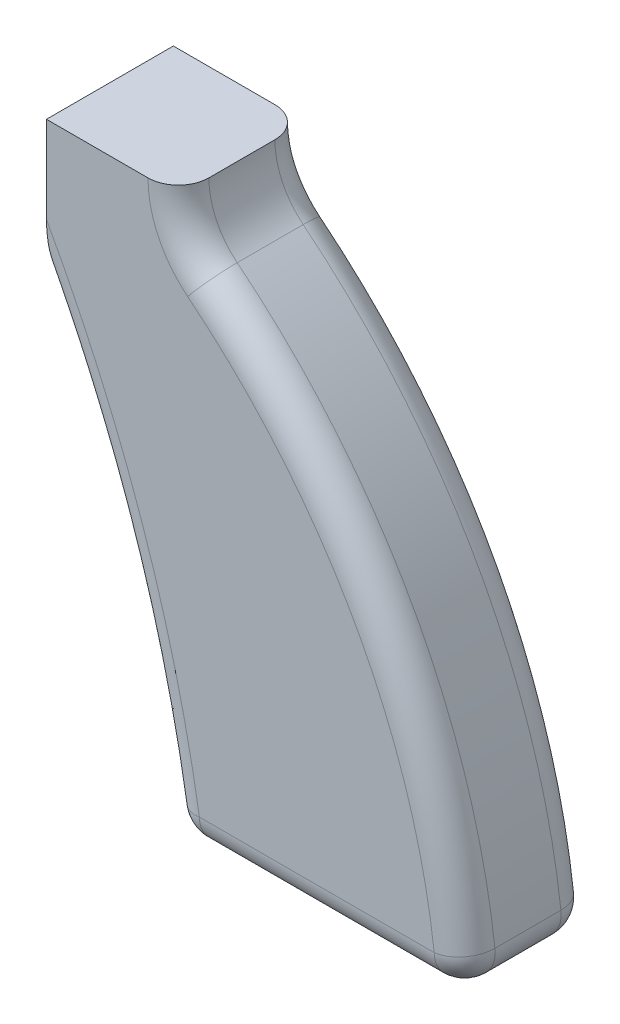
ISO-10303-21;
HEADER;
FILE_DESCRIPTION(('STEP AP214'),'2;1');
FILE_NAME('part.step','',(''),(''),'','','');
FILE_SCHEMA(('AUTOMOTIVE_DESIGN { 1 0 10303 214 1 1 1 1 }'));
ENDSEC;
DATA;
#1=APPLICATION_CONTEXT('core data for automotive mechanical design processes');
#2=APPLICATION_PROTOCOL_DEFINITION('international standard','automotive_design',2000,#1);
#3=PRODUCT_CONTEXT('',#1,'mechanical');
#4=PRODUCT('Part','Part','',(#3));
#5=PRODUCT_RELATED_PRODUCT_CATEGORY('part','',(#4));
#6=PRODUCT_DEFINITION_FORMATION('','',#4);
#7=PRODUCT_DEFINITION_CONTEXT('part definition',#1,'design');
#8=PRODUCT_DEFINITION('design','',#6,#7);
#9=PRODUCT_DEFINITION_SHAPE('','',#8);
#10=(LENGTH_UNIT() NAMED_UNIT(*) SI_UNIT(.MILLI.,.METRE.));
#11=(NAMED_UNIT(*) PLANE_ANGLE_UNIT() SI_UNIT($,.RADIAN.));
#12=(NAMED_UNIT(*) SI_UNIT($,.STERADIAN.) SOLID_ANGLE_UNIT());
#13=UNCERTAINTY_MEASURE_WITH_UNIT(LENGTH_MEASURE(1.E-05),#10,'distance_accuracy_value','');
#14=(GEOMETRIC_REPRESENTATION_CONTEXT(3) GLOBAL_UNCERTAINTY_ASSIGNED_CONTEXT((#13)) GLOBAL_UNIT_ASSIGNED_CONTEXT((#10,
#11,#12)) REPRESENTATION_CONTEXT('',''));
#15=CARTESIAN_POINT('',(0.,0.,0.));
#16=DIRECTION('',(0.,0.,1.));
#17=DIRECTION('',(1.,0.,0.));
#18=AXIS2_PLACEMENT_3D('',#15,#16,#17);
#19=CARTESIAN_POINT('',(0.,0.,12.5));
#20=DIRECTION('',(1.,0.,0.));
#21=DIRECTION('',(0.,1.,0.));
#22=AXIS2_PLACEMENT_3D('',#19,#20,#21);
#23=PLANE('',#22);
#24=DIRECTION('',(0.,-1.,0.));
#25=VECTOR('',#24,1.);
#26=CARTESIAN_POINT('',(0.,0.,-12.5));
#27=LINE('',#26,#25);
#28=CARTESIAN_POINT('',(0.,0.,-12.5));
#29=VERTEX_POINT('',#28);
#30=CARTESIAN_POINT('',(0.,-17.0849348626978,-12.5));
#31=VERTEX_POINT('',#30);
#32=EDGE_CURVE('E160',#29,#31,#27,.T.);
#33=ORIENTED_EDGE('',*,*,#32,.T.);
#34=CARTESIAN_POINT('',(0.,-17.0849348626978,-12.5));
#35=CARTESIAN_POINT('',(0.,-17.4287398376188,-12.499964857327));
#36=CARTESIAN_POINT('',(0.,-17.7725441369321,-12.4930974706652));
#37=CARTESIAN_POINT('',(0.,-18.4596490059866,-12.4656947226758));
#38=CARTESIAN_POINT('',(0.,-18.8029495099367,-12.4451577121361));
#39=CARTESIAN_POINT('',(0.,-19.4901663575469,-12.3902760598332));
#40=CARTESIAN_POINT('',(0.,-19.8340772683226,-12.3558632344532));
#41=CARTESIAN_POINT('',(0.,-20.5201900464619,-12.2729656249962));
#42=CARTESIAN_POINT('',(0.,-20.862391986659,-12.224481445914));
#43=CARTESIAN_POINT('',(0.,-21.5470424652741,-12.1125222079461));
#44=CARTESIAN_POINT('',(0.,-21.8894727381152,-12.0489349483442));
#45=CARTESIAN_POINT('',(0.,-22.571065610986,-11.9061789652204));
#46=CARTESIAN_POINT('',(0.,-22.9102284323369,-11.8270113049348));
#47=CARTESIAN_POINT('',(0.,-23.583534152316,-11.6521018380383));
#48=CARTESIAN_POINT('',(0.,-23.9176858731499,-11.5563941397361));
#49=CARTESIAN_POINT('',(0.,-24.5801347438927,-11.3466787277959));
#50=CARTESIAN_POINT('',(0.,-24.9084341099137,-11.2326781120384));
#51=CARTESIAN_POINT('',(0.,-25.4016496268041,-11.0436246746056));
#52=CARTESIAN_POINT('',(0.,-25.5694654855614,-10.9760887860326));
#53=CARTESIAN_POINT('',(0.,-25.9025502101817,-10.8349755540914));
#54=CARTESIAN_POINT('',(0.,-26.0678190865117,-10.761398235559));
#55=CARTESIAN_POINT('',(0.,-26.3954038651479,-10.6076457911366));
#56=CARTESIAN_POINT('',(0.,-26.5577177109601,-10.5274662699399));
#57=CARTESIAN_POINT('',(0.,-26.8786152338021,-10.3599394457278));
#58=CARTESIAN_POINT('',(0.,-27.0371989862531,-10.2725922878002));
#59=CARTESIAN_POINT('',(0.,-27.3510115899447,-10.0892715769328));
#60=CARTESIAN_POINT('',(0.,-27.5062039149306,-9.99323517198079));
#61=CARTESIAN_POINT('',(0.,-27.8107686139016,-9.79221487530887));
#62=CARTESIAN_POINT('',(0.,-27.9601396694018,-9.6872289735438));
#63=CARTESIAN_POINT('',(0.,-28.2510677309912,-9.46752980171293));
#64=CARTESIAN_POINT('',(0.,-28.3926419383914,-9.35283948743589));
#65=CARTESIAN_POINT('',(0.,-28.6660108553798,-9.11242300898655));
#66=CARTESIAN_POINT('',(0.,-28.7978122026101,-8.98670446416126));
#67=CARTESIAN_POINT('',(0.,-29.0596664673177,-8.71136108977418));
#68=CARTESIAN_POINT('',(0.,-29.1885467081913,-8.5606062046549));
#69=CARTESIAN_POINT('',(0.,-29.425639526051,-8.24306031000025));
#70=CARTESIAN_POINT('',(0.,-29.5338409002037,-8.07626068132197));
#71=CARTESIAN_POINT('',(0.,-29.6754109447138,-7.81314712460076));
#72=CARTESIAN_POINT('',(0.,-29.7194134112135,-7.72250742893394));
#73=CARTESIAN_POINT('',(0.,-29.7988862873725,-7.53758645519352));
#74=CARTESIAN_POINT('',(0.,-29.8343622791027,-7.44330760676858));
#75=CARTESIAN_POINT('',(0.,-29.8955878756046,-7.25197545594446));
#76=CARTESIAN_POINT('',(0.,-29.9213696996637,-7.15493251822402));
#77=CARTESIAN_POINT('',(0.,-29.9624024631608,-6.95869841630696));
#78=CARTESIAN_POINT('',(0.,-29.9776639474321,-6.85950950626169));
#79=CARTESIAN_POINT('',(0.,-29.991568163043,-6.71664471275733));
#80=CARTESIAN_POINT('',(0.,-29.9947274275823,-6.67337281202949));
#81=CARTESIAN_POINT('',(0.,-29.9989435790027,-6.58673689248806));
#82=CARTESIAN_POINT('',(0.,-30.0000009546665,-6.54337289743909));
#83=CARTESIAN_POINT('',(0.,-30.,-6.5));
#84=B_SPLINE_CURVE_WITH_KNOTS('',3,(#34,#35,#36,#37,#38,#39,#40,#41,#42,#43,#44,#45,#46,#47,#48,
#49,#50,#51,#52,#53,#54,#55,#56,#57,#58,#59,#60,#61,#62,#63,#64,#65,#66,#67,#68,#69,#70,#71,#72,
#73,#74,#75,#76,#77,#78,#79,#80,#81,#82,#83),.UNSPECIFIED.,.F.,.F.,(4,2,2,2,2,2,2,2,2,2,2,2,2,2,
2,2,2,2,2,2,2,2,2,2,4),(0.,1.03134679479289,2.06281804202375,3.09942077949291,4.13597895504775,
5.18049283861222,6.22493546725951,7.26724943652862,8.30915994857088,8.85175058505893,
9.39433899112626,9.93729158300136,10.4802331871009,11.0274756335776,11.5748413154655,
12.120946583883,12.6666774787094,13.2603920979104,13.8544274575024,14.1563433091899,
14.4580609623699,14.7587667796313,15.059170750993,15.1892893164207,15.3193776199496),.UNSPECIFIED.);
#85=CARTESIAN_POINT('',(0.,-30.,-6.5));
#86=VERTEX_POINT('',#85);
#87=EDGE_CURVE('E11',#31,#86,#84,.T.);
#88=ORIENTED_EDGE('',*,*,#87,.T.);
#89=DIRECTION('',(0.,0.,-1.));
#90=VECTOR('',#89,1.);
#91=CARTESIAN_POINT('',(0.,-30.,12.5));
#92=LINE('',#91,#90);
#93=CARTESIAN_POINT('',(0.,-30.,6.5));
#94=VERTEX_POINT('',#93);
#95=EDGE_CURVE('E168',#94,#86,#92,.T.);
#96=ORIENTED_EDGE('',*,*,#95,.F.);
#97=CARTESIAN_POINT('',(0.,-30.,6.5));
#98=CARTESIAN_POINT('',(0.,-30.0000364320019,6.58242600891991));
#99=CARTESIAN_POINT('',(0.,-29.9961882591376,6.66483119667377));
#100=CARTESIAN_POINT('',(0.,-29.9810059615346,6.82885553646271));
#101=CARTESIAN_POINT('',(0.,-29.9696805550791,6.91047549174702));
#102=CARTESIAN_POINT('',(0.,-29.9399961647843,7.07145621556594));
#103=CARTESIAN_POINT('',(0.,-29.9217189072021,7.15083213540408));
#104=CARTESIAN_POINT('',(0.,-29.8786064167526,7.30778374872319));
#105=CARTESIAN_POINT('',(0.,-29.8537689788709,7.38535882734797));
#106=CARTESIAN_POINT('',(0.,-29.7563989052976,7.65267672354225));
#107=CARTESIAN_POINT('',(0.,-29.6680579098604,7.83680172177315));
#108=CARTESIAN_POINT('',(0.,-29.4628478012253,8.18892117514027));
#109=CARTESIAN_POINT('',(0.,-29.3458403546669,8.35683173740928));
#110=CARTESIAN_POINT('',(0.,-29.11598012687,8.64528374717714));
#111=CARTESIAN_POINT('',(0.,-29.0066798282083,8.76871466651005));
#112=CARTESIAN_POINT('',(0.,-28.7777376861709,9.00565890586621));
#113=CARTESIAN_POINT('',(0.,-28.6580890745272,9.11916563593829));
#114=CARTESIAN_POINT('',(0.,-28.4106933447742,9.33717948904085));
#115=CARTESIAN_POINT('',(0.,-28.2829375853779,9.44167671946445));
#116=CARTESIAN_POINT('',(0.,-28.0210860185258,9.64245664985964));
#117=CARTESIAN_POINT('',(0.,-27.8869877600235,9.73873613311587));
#118=CARTESIAN_POINT('',(0.,-27.6159694888989,9.92233455112751));
#119=CARTESIAN_POINT('',(0.,-27.4791301542851,10.0097731938312));
#120=CARTESIAN_POINT('',(0.,-27.201462557211,10.1780926582359));
#121=CARTESIAN_POINT('',(0.,-27.0606335037898,10.2589721671393));
#122=CARTESIAN_POINT('',(0.,-26.6330600023028,10.4927361888604));
#123=CARTESIAN_POINT('',(0.,-26.3413846611175,10.6366434293452));
#124=CARTESIAN_POINT('',(0.,-25.7474771049854,10.9046940843962));
#125=CARTESIAN_POINT('',(0.,-25.4451990093107,11.0287340022272));
#126=CARTESIAN_POINT('',(0.,-24.833995322716,11.2587567868531));
#127=CARTESIAN_POINT('',(0.,-24.5250718410139,11.3647452905603));
#128=CARTESIAN_POINT('',(0.,-23.9225875715506,11.5541756592393));
#129=CARTESIAN_POINT('',(0.,-23.6293451112442,11.6386393442574));
#130=CARTESIAN_POINT('',(0.,-23.0394030889769,11.7946150083109));
#131=CARTESIAN_POINT('',(0.,-22.7427030243651,11.8661250785647));
#132=CARTESIAN_POINT('',(0.,-22.1463563487157,11.9970735814779));
#133=CARTESIAN_POINT('',(0.,-21.8467071181238,12.0565000279624));
#134=CARTESIAN_POINT('',(0.,-21.2453446560199,12.1637954246969));
#135=CARTESIAN_POINT('',(0.,-20.9436313653177,12.2116640420674));
#136=CARTESIAN_POINT('',(0.,-20.3463556930913,12.2951781840294));
#137=CARTESIAN_POINT('',(0.,-20.0508323351538,12.3311039344539));
#138=CARTESIAN_POINT('',(0.,-19.4587095752777,12.3926080957939));
#139=CARTESIAN_POINT('',(0.,-19.1621101611103,12.4181863887436));
#140=CARTESIAN_POINT('',(0.,-18.5689155649905,12.4590679319556));
#141=CARTESIAN_POINT('',(0.,-18.2723220596589,12.4743955397528));
#142=CARTESIAN_POINT('',(0.,-17.6787977051133,12.4948515866828));
#143=CARTESIAN_POINT('',(0.,-17.3818668726014,12.4999805104984));
#144=CARTESIAN_POINT('',(0.,-17.0849348626978,12.5));
#145=B_SPLINE_CURVE_WITH_KNOTS('',3,(#97,#98,#99,#100,#101,#102,#103,#104,#105,#106,#107,#108,
#109,#110,#111,#112,#113,#114,#115,#116,#117,#118,#119,#120,#121,#122,#123,#124,#125,#126,#127,
#128,#129,#130,#131,#132,#133,#134,#135,#136,#137,#138,#139,#140,#141,#142,#143,#144),
.UNSPECIFIED.,.F.,.F.,(4,2,2,2,2,2,2,2,2,2,2,2,2,2,2,2,2,2,2,2,2,2,2,4),(0.,0.247154512361413,
0.494021355951403,0.738071492661665,0.982203764372273,1.59116361114361,2.20312203795052,
2.69703334892268,3.19127017927433,3.68604295778751,4.1810085279752,4.66797135398479,
5.15503140531164,6.12970861207039,7.10930883082805,8.0886025868784,9.0037828453069,
9.91909785074061,10.8353164074217,11.7515613491587,12.644473555661,13.5373959414829,
14.4281889665642,15.3189396565392),.UNSPECIFIED.);
#146=CARTESIAN_POINT('',(0.,-17.0849348626978,12.5));
#147=VERTEX_POINT('',#146);
#148=EDGE_CURVE('E48',#94,#147,#145,.T.);
#149=ORIENTED_EDGE('',*,*,#148,.T.);
#150=DIRECTION('',(0.,-1.,0.));
#151=VECTOR('',#150,1.);
#152=CARTESIAN_POINT('',(0.,0.,12.5));
#153=LINE('',#152,#151);
#154=CARTESIAN_POINT('',(0.,0.,12.5));
#155=VERTEX_POINT('',#154);
#156=EDGE_CURVE('E139',#155,#147,#153,.T.);
#157=ORIENTED_EDGE('',*,*,#156,.F.);
#158=DIRECTION('',(0.,0.,-1.));
#159=VECTOR('',#158,1.);
#160=CARTESIAN_POINT('',(0.,0.,12.5));
#161=LINE('',#160,#159);
#162=EDGE_CURVE('E145',#155,#29,#161,.T.);
#163=ORIENTED_EDGE('',*,*,#162,.T.);
#164=EDGE_LOOP('',(#33,#88,#96,#149,#157,#163));
#165=FACE_BOUND('',#164,.T.);
#166=ADVANCED_FACE('F38',(#165),#23,.F.);
#167=CARTESIAN_POINT('',(-237.254327688808,-148.048227402752,12.5));
#168=DIRECTION('',(0.,0.,-1.));
#169=DIRECTION('',(-1.,0.,0.));
#170=AXIS2_PLACEMENT_3D('',#167,#168,#169);
#171=CYLINDRICAL_SURFACE('',#170,265.);
#172=ORIENTED_EDGE('',*,*,#95,.T.);
#173=CARTESIAN_POINT('',(-237.254327688808,-148.048227402752,-6.5));
#174=DIRECTION('',(0.,0.,-1.));
#175=DIRECTION('',(-1.,0.,0.));
#176=AXIS2_PLACEMENT_3D('',#173,#174,#175);
#177=CIRCLE('',#176,265.);
#178=CARTESIAN_POINT('',(24.2217085773226,-104.975237507072,-6.5));
#179=VERTEX_POINT('',#178);
#180=EDGE_CURVE('E208',#86,#179,#177,.T.);
#181=ORIENTED_EDGE('',*,*,#180,.T.);
#182=DIRECTION('',(0.,0.,-1.));
#183=VECTOR('',#182,1.);
#184=CARTESIAN_POINT('',(24.2217085773226,-104.975237507072,12.5));
#185=LINE('',#184,#183);
#186=CARTESIAN_POINT('',(24.2217085773226,-104.975237507072,6.5));
#187=VERTEX_POINT('',#186);
#188=EDGE_CURVE('E206',#179,#187,#185,.F.);
#189=ORIENTED_EDGE('',*,*,#188,.T.);
#190=CARTESIAN_POINT('',(-237.254327688808,-148.048227402752,6.5));
#191=DIRECTION('',(0.,0.,-1.));
#192=DIRECTION('',(-1.,0.,0.));
#193=AXIS2_PLACEMENT_3D('',#190,#191,#192);
#194=CIRCLE('',#193,265.);
#195=EDGE_CURVE('E204',#187,#94,#194,.F.);
#196=ORIENTED_EDGE('',*,*,#195,.T.);
#197=EDGE_LOOP('',(#172,#181,#189,#196));
#198=FACE_BOUND('',#197,.T.);
#199=ADVANCED_FACE('F229',(#198),#171,.F.);
#200=CARTESIAN_POINT('',(83.,-110.,12.5));
#201=DIRECTION('',(0.,1.,0.));
#202=DIRECTION('',(-1.,0.,0.));
#203=AXIS2_PLACEMENT_3D('',#200,#201,#202);
#204=PLANE('',#203);
#205=DIRECTION('',(1.,0.,0.));
#206=VECTOR('',#205,1.);
#207=CARTESIAN_POINT('',(83.,-110.,6.5));
#208=LINE('',#207,#206);
#209=CARTESIAN_POINT('',(76.39930979163,-110.,6.5));
#210=VERTEX_POINT('',#209);
#211=CARTESIAN_POINT('',(30.1419207191972,-110.,6.5));
#212=VERTEX_POINT('',#211);
#213=EDGE_CURVE('E197',#210,#212,#208,.F.);
#214=ORIENTED_EDGE('',*,*,#213,.T.);
#215=DIRECTION('',(0.,0.,-1.));
#216=VECTOR('',#215,1.);
#217=CARTESIAN_POINT('',(30.1419207191972,-110.,12.5));
#218=LINE('',#217,#216);
#219=CARTESIAN_POINT('',(30.1419207191972,-110.,-6.5));
#220=VERTEX_POINT('',#219);
#221=EDGE_CURVE('E201',#212,#220,#218,.T.);
#222=ORIENTED_EDGE('',*,*,#221,.T.);
#223=DIRECTION('',(1.,0.,0.));
#224=VECTOR('',#223,1.);
#225=CARTESIAN_POINT('',(83.,-110.,-6.5));
#226=LINE('',#225,#224);
#227=CARTESIAN_POINT('',(76.39930979163,-110.,-6.5));
#228=VERTEX_POINT('',#227);
#229=EDGE_CURVE('E199',#220,#228,#226,.T.);
#230=ORIENTED_EDGE('',*,*,#229,.T.);
#231=DIRECTION('',(0.,0.,-1.));
#232=VECTOR('',#231,1.);
#233=CARTESIAN_POINT('',(76.39930979163,-110.,12.5));
#234=LINE('',#233,#232);
#235=EDGE_CURVE('E195',#228,#210,#234,.F.);
#236=ORIENTED_EDGE('',*,*,#235,.T.);
#237=EDGE_LOOP('',(#214,#222,#230,#236));
#238=FACE_BOUND('',#237,.T.);
#239=ADVANCED_FACE('F321',(#238),#204,.F.);
#240=CARTESIAN_POINT('',(-55.6472038329479,-119.897114190762,12.5));
#241=DIRECTION('',(0.,0.,-1.));
#242=DIRECTION('',(-1.,0.,0.));
#243=AXIS2_PLACEMENT_3D('',#240,#241,#242);
#244=CYLINDRICAL_SURFACE('',#243,139.);
#245=DIRECTION('',(0.,0.,-1.));
#246=VECTOR('',#245,1.);
#247=CARTESIAN_POINT('',(82.3562953686787,-103.2828369538,12.5));
#248=LINE('',#247,#246);
#249=CARTESIAN_POINT('',(82.3562953686787,-103.2828369538,6.5));
#250=VERTEX_POINT('',#249);
#251=CARTESIAN_POINT('',(82.3562953686787,-103.2828369538,-6.5));
#252=VERTEX_POINT('',#251);
#253=EDGE_CURVE('E56',#250,#252,#248,.T.);
#254=ORIENTED_EDGE('',*,*,#253,.T.);
#255=CARTESIAN_POINT('',(-55.6472038329479,-119.897114190762,-6.5));
#256=DIRECTION('',(0.,0.,-1.));
#257=DIRECTION('',(-1.,0.,0.));
#258=AXIS2_PLACEMENT_3D('',#255,#256,#257);
#259=CIRCLE('',#258,139.);
#260=CARTESIAN_POINT('',(31.5863113149726,-11.678290343256,-6.5));
#261=VERTEX_POINT('',#260);
#262=EDGE_CURVE('E212',#252,#261,#259,.F.);
#263=ORIENTED_EDGE('',*,*,#262,.T.);
#264=DIRECTION('',(0.,0.,-1.));
#265=VECTOR('',#264,1.);
#266=CARTESIAN_POINT('',(31.5863113149726,-11.678290343256,12.5));
#267=LINE('',#266,#265);
#268=CARTESIAN_POINT('',(31.5863113149726,-11.678290343256,6.5));
#269=VERTEX_POINT('',#268);
#270=EDGE_CURVE('E165',#269,#261,#267,.T.);
#271=ORIENTED_EDGE('',*,*,#270,.F.);
#272=CARTESIAN_POINT('',(-55.6472038329479,-119.897114190762,6.5));
#273=DIRECTION('',(0.,0.,-1.));
#274=DIRECTION('',(-1.,0.,0.));
#275=AXIS2_PLACEMENT_3D('',#272,#273,#274);
#276=CIRCLE('',#275,139.);
#277=EDGE_CURVE('E61',#269,#250,#276,.T.);
#278=ORIENTED_EDGE('',*,*,#277,.T.);
#279=EDGE_LOOP('',(#254,#263,#271,#278));
#280=FACE_BOUND('',#279,.T.);
#281=ADVANCED_FACE('F361',(#280),#244,.T.);
#282=CARTESIAN_POINT('',(41.,0.,12.5));
#283=DIRECTION('',(0.,0.,-1.));
#284=DIRECTION('',(-1.,0.,0.));
#285=AXIS2_PLACEMENT_3D('',#282,#283,#284);
#286=CYLINDRICAL_SURFACE('',#285,15.);
#287=ORIENTED_EDGE('',*,*,#270,.T.);
#288=CARTESIAN_POINT('',(41.,0.,-6.5));
#289=DIRECTION('',(0.,0.,-1.));
#290=DIRECTION('',(-1.,0.,0.));
#291=AXIS2_PLACEMENT_3D('',#288,#289,#290);
#292=CIRCLE('',#291,15.);
#293=CARTESIAN_POINT('',(26.,0.,-6.5));
#294=VERTEX_POINT('',#293);
#295=EDGE_CURVE('E173',#261,#294,#292,.T.);
#296=ORIENTED_EDGE('',*,*,#295,.T.);
#297=DIRECTION('',(0.,0.,-1.));
#298=VECTOR('',#297,1.);
#299=CARTESIAN_POINT('',(26.,0.,12.5));
#300=LINE('',#299,#298);
#301=CARTESIAN_POINT('',(26.,0.,6.5));
#302=VERTEX_POINT('',#301);
#303=EDGE_CURVE('E155',#302,#294,#300,.T.);
#304=ORIENTED_EDGE('',*,*,#303,.F.);
#305=CARTESIAN_POINT('',(41.,0.,6.5));
#306=DIRECTION('',(0.,0.,-1.));
#307=DIRECTION('',(-1.,0.,0.));
#308=AXIS2_PLACEMENT_3D('',#305,#306,#307);
#309=CIRCLE('',#308,15.);
#310=EDGE_CURVE('E171',#302,#269,#309,.F.);
#311=ORIENTED_EDGE('',*,*,#310,.T.);
#312=EDGE_LOOP('',(#287,#296,#304,#311));
#313=FACE_BOUND('',#312,.T.);
#314=ADVANCED_FACE('F365',(#313),#286,.F.);
#315=CARTESIAN_POINT('',(0.,0.,12.5));
#316=DIRECTION('',(0.,-1.,0.));
#317=DIRECTION('',(0.,0.,-1.));
#318=AXIS2_PLACEMENT_3D('',#315,#316,#317);
#319=PLANE('',#318);
#320=ORIENTED_EDGE('',*,*,#303,.T.);
#321=CARTESIAN_POINT('',(20.,0.,-6.5));
#322=DIRECTION('',(0.,-1.,0.));
#323=DIRECTION('',(0.,0.,-1.));
#324=AXIS2_PLACEMENT_3D('',#321,#322,#323);
#325=CIRCLE('',#324,6.);
#326=CARTESIAN_POINT('',(20.,0.,-12.5));
#327=VERTEX_POINT('',#326);
#328=EDGE_CURVE('E178',#294,#327,#325,.F.);
#329=ORIENTED_EDGE('',*,*,#328,.T.);
#330=DIRECTION('',(-1.,0.,0.));
#331=VECTOR('',#330,1.);
#332=CARTESIAN_POINT('',(0.,0.,-12.5));
#333=LINE('',#332,#331);
#334=EDGE_CURVE('E151',#327,#29,#333,.T.);
#335=ORIENTED_EDGE('',*,*,#334,.T.);
#336=ORIENTED_EDGE('',*,*,#162,.F.);
#337=DIRECTION('',(-1.,0.,0.));
#338=VECTOR('',#337,1.);
#339=CARTESIAN_POINT('',(0.,0.,12.5));
#340=LINE('',#339,#338);
#341=CARTESIAN_POINT('',(20.,0.,12.5));
#342=VERTEX_POINT('',#341);
#343=EDGE_CURVE('E135',#342,#155,#340,.T.);
#344=ORIENTED_EDGE('',*,*,#343,.F.);
#345=CARTESIAN_POINT('',(20.,0.,6.5));
#346=DIRECTION('',(0.,-1.,0.));
#347=DIRECTION('',(0.,0.,-1.));
#348=AXIS2_PLACEMENT_3D('',#345,#346,#347);
#349=CIRCLE('',#348,6.);
#350=EDGE_CURVE('E176',#342,#302,#349,.F.);
#351=ORIENTED_EDGE('',*,*,#350,.T.);
#352=EDGE_LOOP('',(#320,#329,#335,#336,#344,#351));
#353=FACE_BOUND('',#352,.T.);
#354=ADVANCED_FACE('F149',(#353),#319,.F.);
#355=CARTESIAN_POINT('',(-237.254327688808,-148.048227402752,12.5));
#356=DIRECTION('',(0.,0.,-1.));
#357=DIRECTION('',(-1.,0.,0.));
#358=AXIS2_PLACEMENT_3D('',#355,#356,#357);
#359=PLANE('',#358);
#360=ORIENTED_EDGE('',*,*,#156,.T.);
#361=CARTESIAN_POINT('',(-237.254327688808,-148.048227402752,12.5));
#362=DIRECTION('',(0.,0.,-1.));
#363=DIRECTION('',(-1.,0.,0.));
#364=AXIS2_PLACEMENT_3D('',#361,#362,#363);
#365=CIRCLE('',#364,271.);
#366=CARTESIAN_POINT('',(30.1419207191972,-104.,12.5));
#367=VERTEX_POINT('',#366);
#368=EDGE_CURVE('E193',#147,#367,#365,.T.);
#369=ORIENTED_EDGE('',*,*,#368,.T.);
#370=DIRECTION('',(1.,0.,0.));
#371=VECTOR('',#370,1.);
#372=CARTESIAN_POINT('',(-237.254327688808,-104.,12.5));
#373=LINE('',#372,#371);
#374=CARTESIAN_POINT('',(76.3993097916301,-104.,12.5));
#375=VERTEX_POINT('',#374);
#376=EDGE_CURVE('E190',#367,#375,#373,.T.);
#377=ORIENTED_EDGE('',*,*,#376,.T.);
#378=CARTESIAN_POINT('',(-55.6472038329479,-119.897114190762,12.5));
#379=DIRECTION('',(0.,0.,-1.));
#380=DIRECTION('',(-1.,0.,0.));
#381=AXIS2_PLACEMENT_3D('',#378,#379,#380);
#382=CIRCLE('',#381,133.);
#383=CARTESIAN_POINT('',(27.8208358409616,-16.3496064805585,12.5));
#384=VERTEX_POINT('',#383);
#385=EDGE_CURVE('E188',#375,#384,#382,.F.);
#386=ORIENTED_EDGE('',*,*,#385,.T.);
#387=CARTESIAN_POINT('',(41.,0.,12.5));
#388=DIRECTION('',(0.,0.,-1.));
#389=DIRECTION('',(-1.,0.,0.));
#390=AXIS2_PLACEMENT_3D('',#387,#388,#389);
#391=CIRCLE('',#390,21.);
#392=EDGE_CURVE('E142',#384,#342,#391,.T.);
#393=ORIENTED_EDGE('',*,*,#392,.T.);
#394=ORIENTED_EDGE('',*,*,#343,.T.);
#395=EDGE_LOOP('',(#360,#369,#377,#386,#393,#394));
#396=FACE_BOUND('',#395,.T.);
#397=ADVANCED_FACE('F137',(#396),#359,.F.);
#398=CARTESIAN_POINT('',(-237.254327688808,-148.048227402752,-12.5));
#399=DIRECTION('',(0.,0.,-1.));
#400=DIRECTION('',(-1.,0.,0.));
#401=AXIS2_PLACEMENT_3D('',#398,#399,#400);
#402=PLANE('',#401);
#403=DIRECTION('',(1.,0.,0.));
#404=VECTOR('',#403,1.);
#405=CARTESIAN_POINT('',(25.,-104.,-12.5));
#406=LINE('',#405,#404);
#407=CARTESIAN_POINT('',(76.3993097916301,-104.,-12.5));
#408=VERTEX_POINT('',#407);
#409=CARTESIAN_POINT('',(30.1419207191972,-104.,-12.5));
#410=VERTEX_POINT('',#409);
#411=EDGE_CURVE('E182',#408,#410,#406,.F.);
#412=ORIENTED_EDGE('',*,*,#411,.T.);
#413=CARTESIAN_POINT('',(-237.254327688808,-148.048227402752,-12.5));
#414=DIRECTION('',(0.,0.,-1.));
#415=DIRECTION('',(-1.,0.,0.));
#416=AXIS2_PLACEMENT_3D('',#413,#414,#415);
#417=CIRCLE('',#416,271.);
#418=EDGE_CURVE('E186',#410,#31,#417,.F.);
#419=ORIENTED_EDGE('',*,*,#418,.T.);
#420=ORIENTED_EDGE('',*,*,#32,.F.);
#421=ORIENTED_EDGE('',*,*,#334,.F.);
#422=CARTESIAN_POINT('',(41.,0.,-12.5));
#423=DIRECTION('',(0.,0.,-1.));
#424=DIRECTION('',(-1.,0.,0.));
#425=AXIS2_PLACEMENT_3D('',#422,#423,#424);
#426=CIRCLE('',#425,21.);
#427=CARTESIAN_POINT('',(27.8208358409616,-16.3496064805585,-12.5));
#428=VERTEX_POINT('',#427);
#429=EDGE_CURVE('E184',#327,#428,#426,.F.);
#430=ORIENTED_EDGE('',*,*,#429,.T.);
#431=CARTESIAN_POINT('',(-55.6472038329479,-119.897114190762,-12.5));
#432=DIRECTION('',(0.,0.,-1.));
#433=DIRECTION('',(-1.,0.,0.));
#434=AXIS2_PLACEMENT_3D('',#431,#432,#433);
#435=CIRCLE('',#434,133.);
#436=EDGE_CURVE('E180',#428,#408,#435,.T.);
#437=ORIENTED_EDGE('',*,*,#436,.T.);
#438=EDGE_LOOP('',(#412,#419,#420,#421,#430,#437));
#439=FACE_BOUND('',#438,.T.);
#440=ADVANCED_FACE('F285',(#439),#402,.T.);
#441=CARTESIAN_POINT('',(-237.254327688808,-148.048227402752,6.5));
#442=DIRECTION('',(0.,0.,-1.));
#443=DIRECTION('',(-1.,0.,0.));
#444=AXIS2_PLACEMENT_3D('',#441,#442,#443);
#445=TOROIDAL_SURFACE('',#444,271.,6.);
#446=CARTESIAN_POINT('',(30.1419207191972,-104.,6.5));
#447=DIRECTION('',(0.162539584512002,-0.986702023645774,0.));
#448=DIRECTION('',(0.986702023645774,0.162539584512002,0.));
#449=AXIS2_PLACEMENT_3D('',#446,#447,#448);
#450=CIRCLE('',#449,6.);
#451=EDGE_CURVE('E43',#367,#187,#450,.T.);
#452=ORIENTED_EDGE('',*,*,#451,.F.);
#453=ORIENTED_EDGE('',*,*,#368,.F.);
#454=ORIENTED_EDGE('',*,*,#148,.F.);
#455=ORIENTED_EDGE('',*,*,#195,.F.);
#456=EDGE_LOOP('',(#452,#453,#454,#455));
#457=FACE_BOUND('',#456,.T.);
#458=ADVANCED_FACE('F40',(#457),#445,.T.);
#459=CARTESIAN_POINT('',(30.1419207191972,-104.,6.5));
#460=DIRECTION('',(0.,0.,1.));
#461=DIRECTION('',(1.,0.,0.));
#462=AXIS2_PLACEMENT_3D('',#459,#460,#461);
#463=SPHERICAL_SURFACE('',#462,6.);
#464=CARTESIAN_POINT('',(30.1419207191972,-104.,6.5));
#465=DIRECTION('',(-1.,0.,0.));
#466=DIRECTION('',(0.,0.,1.));
#467=AXIS2_PLACEMENT_3D('',#464,#465,#466);
#468=CIRCLE('',#467,6.);
#469=EDGE_CURVE('E291',#367,#212,#468,.F.);
#470=ORIENTED_EDGE('',*,*,#469,.F.);
#471=ORIENTED_EDGE('',*,*,#451,.T.);
#472=CARTESIAN_POINT('',(30.1419207191973,-104.,6.5));
#473=DIRECTION('',(0.,0.,1.));
#474=DIRECTION('',(1.,0.,0.));
#475=AXIS2_PLACEMENT_3D('',#472,#473,#474);
#476=CIRCLE('',#475,6.);
#477=EDGE_CURVE('E295',#212,#187,#476,.F.);
#478=ORIENTED_EDGE('',*,*,#477,.F.);
#479=EDGE_LOOP('',(#470,#471,#478));
#480=FACE_BOUND('',#479,.T.);
#481=ADVANCED_FACE('F278',(#480),#463,.T.);
#482=CARTESIAN_POINT('',(41.,0.,6.5));
#483=DIRECTION('',(0.,0.,-1.));
#484=DIRECTION('',(-1.,0.,0.));
#485=AXIS2_PLACEMENT_3D('',#482,#483,#484);
#486=TOROIDAL_SURFACE('',#485,21.,6.);
#487=ORIENTED_EDGE('',*,*,#350,.F.);
#488=ORIENTED_EDGE('',*,*,#392,.F.);
#489=CARTESIAN_POINT('',(27.8208358409616,-16.3496064805584,6.5));
#490=DIRECTION('',(0.778552689550402,-0.627579245668493,0.));
#491=DIRECTION('',(0.627579245668493,0.778552689550402,0.));
#492=AXIS2_PLACEMENT_3D('',#489,#490,#491);
#493=CIRCLE('',#492,6.);
#494=EDGE_CURVE('E298',#269,#384,#493,.T.);
#495=ORIENTED_EDGE('',*,*,#494,.F.);
#496=ORIENTED_EDGE('',*,*,#310,.F.);
#497=EDGE_LOOP('',(#487,#488,#495,#496));
#498=FACE_BOUND('',#497,.T.);
#499=ADVANCED_FACE('F275',(#498),#486,.T.);
#500=CARTESIAN_POINT('',(-237.254327688808,-148.048227402752,-6.5));
#501=DIRECTION('',(0.,0.,-1.));
#502=DIRECTION('',(-1.,0.,0.));
#503=AXIS2_PLACEMENT_3D('',#500,#501,#502);
#504=TOROIDAL_SURFACE('',#503,271.,6.);
#505=ORIENTED_EDGE('',*,*,#87,.F.);
#506=ORIENTED_EDGE('',*,*,#418,.F.);
#507=CARTESIAN_POINT('',(30.1419207191973,-104.,-6.5));
#508=DIRECTION('',(0.162539584512002,-0.986702023645774,0.));
#509=DIRECTION('',(0.986702023645774,0.162539584512002,0.));
#510=AXIS2_PLACEMENT_3D('',#507,#508,#509);
#511=CIRCLE('',#510,6.);
#512=EDGE_CURVE('E310',#179,#410,#511,.T.);
#513=ORIENTED_EDGE('',*,*,#512,.F.);
#514=ORIENTED_EDGE('',*,*,#180,.F.);
#515=EDGE_LOOP('',(#505,#506,#513,#514));
#516=FACE_BOUND('',#515,.T.);
#517=ADVANCED_FACE('F270',(#516),#504,.T.);
#518=CARTESIAN_POINT('',(30.1419207191972,-104.,12.5));
#519=DIRECTION('',(0.,0.,-1.));
#520=DIRECTION('',(-1.,0.,0.));
#521=AXIS2_PLACEMENT_3D('',#518,#519,#520);
#522=CYLINDRICAL_SURFACE('',#521,6.);
#523=ORIENTED_EDGE('',*,*,#477,.T.);
#524=ORIENTED_EDGE('',*,*,#188,.F.);
#525=CARTESIAN_POINT('',(30.1419207191972,-104.,-6.5));
#526=DIRECTION('',(0.,0.,-1.));
#527=DIRECTION('',(-1.,0.,0.));
#528=AXIS2_PLACEMENT_3D('',#525,#526,#527);
#529=CIRCLE('',#528,6.);
#530=EDGE_CURVE('E313',#220,#179,#529,.T.);
#531=ORIENTED_EDGE('',*,*,#530,.F.);
#532=ORIENTED_EDGE('',*,*,#221,.F.);
#533=EDGE_LOOP('',(#523,#524,#531,#532));
#534=FACE_BOUND('',#533,.T.);
#535=ADVANCED_FACE('F267',(#534),#522,.T.);
#536=CARTESIAN_POINT('',(-237.254327688808,-104.,6.5));
#537=DIRECTION('',(1.,0.,0.));
#538=DIRECTION('',(0.,1.,0.));
#539=AXIS2_PLACEMENT_3D('',#536,#537,#538);
#540=CYLINDRICAL_SURFACE('',#539,6.);
#541=ORIENTED_EDGE('',*,*,#469,.T.);
#542=ORIENTED_EDGE('',*,*,#213,.F.);
#543=CARTESIAN_POINT('',(76.3993097916301,-104.,6.5));
#544=DIRECTION('',(1.,0.,0.));
#545=DIRECTION('',(0.,1.,0.));
#546=AXIS2_PLACEMENT_3D('',#543,#544,#545);
#547=CIRCLE('',#546,6.);
#548=EDGE_CURVE('E302',#375,#210,#547,.T.);
#549=ORIENTED_EDGE('',*,*,#548,.F.);
#550=ORIENTED_EDGE('',*,*,#376,.F.);
#551=EDGE_LOOP('',(#541,#542,#549,#550));
#552=FACE_BOUND('',#551,.T.);
#553=ADVANCED_FACE('F263',(#552),#540,.T.);
#554=CARTESIAN_POINT('',(-55.6472038329479,-119.897114190762,6.5));
#555=DIRECTION('',(0.,0.,-1.));
#556=DIRECTION('',(-1.,0.,0.));
#557=AXIS2_PLACEMENT_3D('',#554,#555,#556);
#558=TOROIDAL_SURFACE('',#557,133.,6.);
#559=ORIENTED_EDGE('',*,*,#494,.T.);
#560=ORIENTED_EDGE('',*,*,#385,.F.);
#561=CARTESIAN_POINT('',(76.3993097916301,-104.,6.5));
#562=DIRECTION('',(0.119527174366631,-0.992830929508105,0.));
#563=DIRECTION('',(0.992830929508106,0.119527174366631,0.));
#564=AXIS2_PLACEMENT_3D('',#561,#562,#563);
#565=CIRCLE('',#564,6.);
#566=EDGE_CURVE('E306',#250,#375,#565,.T.);
#567=ORIENTED_EDGE('',*,*,#566,.F.);
#568=ORIENTED_EDGE('',*,*,#277,.F.);
#569=EDGE_LOOP('',(#559,#560,#567,#568));
#570=FACE_BOUND('',#569,.T.);
#571=ADVANCED_FACE('F259',(#570),#558,.T.);
#572=CARTESIAN_POINT('',(30.1419207191972,-104.,-6.5));
#573=DIRECTION('',(0.,0.,-1.));
#574=DIRECTION('',(-1.,0.,0.));
#575=AXIS2_PLACEMENT_3D('',#572,#573,#574);
#576=SPHERICAL_SURFACE('',#575,6.);
#577=ORIENTED_EDGE('',*,*,#530,.T.);
#578=ORIENTED_EDGE('',*,*,#512,.T.);
#579=CARTESIAN_POINT('',(30.1419207191972,-104.,-6.5));
#580=DIRECTION('',(-1.,0.,0.));
#581=DIRECTION('',(0.,-1.,0.));
#582=AXIS2_PLACEMENT_3D('',#579,#580,#581);
#583=CIRCLE('',#582,6.);
#584=EDGE_CURVE('E327',#220,#410,#583,.F.);
#585=ORIENTED_EDGE('',*,*,#584,.F.);
#586=EDGE_LOOP('',(#577,#578,#585));
#587=FACE_BOUND('',#586,.T.);
#588=ADVANCED_FACE('F255',(#587),#576,.T.);
#589=CARTESIAN_POINT('',(76.3993097916301,-104.,6.5));
#590=DIRECTION('',(0.,0.,1.));
#591=DIRECTION('',(1.,0.,0.));
#592=AXIS2_PLACEMENT_3D('',#589,#590,#591);
#593=SPHERICAL_SURFACE('',#592,6.);
#594=ORIENTED_EDGE('',*,*,#566,.T.);
#595=ORIENTED_EDGE('',*,*,#548,.T.);
#596=CARTESIAN_POINT('',(76.39930979163,-104.,6.5));
#597=DIRECTION('',(0.,0.,1.));
#598=DIRECTION('',(1.,0.,0.));
#599=AXIS2_PLACEMENT_3D('',#596,#597,#598);
#600=CIRCLE('',#599,6.);
#601=EDGE_CURVE('E324',#250,#210,#600,.F.);
#602=ORIENTED_EDGE('',*,*,#601,.F.);
#603=EDGE_LOOP('',(#594,#595,#602));
#604=FACE_BOUND('',#603,.T.);
#605=ADVANCED_FACE('F251',(#604),#593,.T.);
#606=CARTESIAN_POINT('',(83.,-104.,-6.5));
#607=DIRECTION('',(-1.,0.,0.));
#608=DIRECTION('',(0.,-1.,0.));
#609=AXIS2_PLACEMENT_3D('',#606,#607,#608);
#610=CYLINDRICAL_SURFACE('',#609,6.);
#611=ORIENTED_EDGE('',*,*,#584,.T.);
#612=ORIENTED_EDGE('',*,*,#411,.F.);
#613=CARTESIAN_POINT('',(76.39930979163,-104.,-6.5));
#614=DIRECTION('',(1.,0.,0.));
#615=DIRECTION('',(0.,0.,-1.));
#616=AXIS2_PLACEMENT_3D('',#613,#614,#615);
#617=CIRCLE('',#616,6.);
#618=EDGE_CURVE('E328',#228,#408,#617,.T.);
#619=ORIENTED_EDGE('',*,*,#618,.F.);
#620=ORIENTED_EDGE('',*,*,#229,.F.);
#621=EDGE_LOOP('',(#611,#612,#619,#620));
#622=FACE_BOUND('',#621,.T.);
#623=ADVANCED_FACE('F247',(#622),#610,.T.);
#624=CARTESIAN_POINT('',(76.39930979163,-104.,12.5));
#625=DIRECTION('',(0.,0.,-1.));
#626=DIRECTION('',(-1.,0.,0.));
#627=AXIS2_PLACEMENT_3D('',#624,#625,#626);
#628=CYLINDRICAL_SURFACE('',#627,6.);
#629=ORIENTED_EDGE('',*,*,#601,.T.);
#630=ORIENTED_EDGE('',*,*,#235,.F.);
#631=CARTESIAN_POINT('',(76.3993097916301,-104.,-6.5));
#632=DIRECTION('',(0.,0.,-1.));
#633=DIRECTION('',(-1.,0.,0.));
#634=AXIS2_PLACEMENT_3D('',#631,#632,#633);
#635=CIRCLE('',#634,6.);
#636=EDGE_CURVE('E333',#252,#228,#635,.T.);
#637=ORIENTED_EDGE('',*,*,#636,.F.);
#638=ORIENTED_EDGE('',*,*,#253,.F.);
#639=EDGE_LOOP('',(#629,#630,#637,#638));
#640=FACE_BOUND('',#639,.T.);
#641=ADVANCED_FACE('F243',(#640),#628,.T.);
#642=CARTESIAN_POINT('',(76.3993097916301,-104.,-6.5));
#643=DIRECTION('',(0.,0.,-1.));
#644=DIRECTION('',(-1.,0.,0.));
#645=AXIS2_PLACEMENT_3D('',#642,#643,#644);
#646=SPHERICAL_SURFACE('',#645,6.);
#647=ORIENTED_EDGE('',*,*,#636,.T.);
#648=ORIENTED_EDGE('',*,*,#618,.T.);
#649=CARTESIAN_POINT('',(76.3993097916301,-104.,-6.5));
#650=DIRECTION('',(0.119527174366631,-0.992830929508105,0.));
#651=DIRECTION('',(0.992830929508106,0.119527174366631,0.));
#652=AXIS2_PLACEMENT_3D('',#649,#650,#651);
#653=CIRCLE('',#652,6.);
#654=EDGE_CURVE('E342',#252,#408,#653,.F.);
#655=ORIENTED_EDGE('',*,*,#654,.F.);
#656=EDGE_LOOP('',(#647,#648,#655));
#657=FACE_BOUND('',#656,.T.);
#658=ADVANCED_FACE('F239',(#657),#646,.T.);
#659=CARTESIAN_POINT('',(-55.6472038329479,-119.897114190762,-6.5));
#660=DIRECTION('',(0.,0.,-1.));
#661=DIRECTION('',(-1.,0.,0.));
#662=AXIS2_PLACEMENT_3D('',#659,#660,#661);
#663=TOROIDAL_SURFACE('',#662,133.,6.);
#664=ORIENTED_EDGE('',*,*,#654,.T.);
#665=ORIENTED_EDGE('',*,*,#436,.F.);
#666=CARTESIAN_POINT('',(27.8208358409616,-16.3496064805585,-6.5));
#667=DIRECTION('',(-0.778552689550402,0.627579245668493,0.));
#668=DIRECTION('',(-0.627579245668493,-0.778552689550402,0.));
#669=AXIS2_PLACEMENT_3D('',#666,#667,#668);
#670=CIRCLE('',#669,6.);
#671=EDGE_CURVE('E344',#261,#428,#670,.T.);
#672=ORIENTED_EDGE('',*,*,#671,.F.);
#673=ORIENTED_EDGE('',*,*,#262,.F.);
#674=EDGE_LOOP('',(#664,#665,#672,#673));
#675=FACE_BOUND('',#674,.T.);
#676=ADVANCED_FACE('F235',(#675),#663,.T.);
#677=CARTESIAN_POINT('',(41.,0.,-6.5));
#678=DIRECTION('',(0.,0.,-1.));
#679=DIRECTION('',(-1.,0.,0.));
#680=AXIS2_PLACEMENT_3D('',#677,#678,#679);
#681=TOROIDAL_SURFACE('',#680,21.,6.);
#682=ORIENTED_EDGE('',*,*,#671,.T.);
#683=ORIENTED_EDGE('',*,*,#429,.F.);
#684=ORIENTED_EDGE('',*,*,#328,.F.);
#685=ORIENTED_EDGE('',*,*,#295,.F.);
#686=EDGE_LOOP('',(#682,#683,#684,#685));
#687=FACE_BOUND('',#686,.T.);
#688=ADVANCED_FACE('F231',(#687),#681,.T.);
#689=CLOSED_SHELL('',(#166,#199,#239,#281,#314,#354,#397,#440,#458,#481,#499,#517,#535,#553,
#571,#588,#605,#623,#641,#658,#676,#688));
#690=MANIFOLD_SOLID_BREP('B2',#689);
#691=ADVANCED_BREP_SHAPE_REPRESENTATION('',(#18,#690),#14);
#692=SHAPE_DEFINITION_REPRESENTATION(#9,#691);
ENDSEC;
END-ISO-10303-21;
